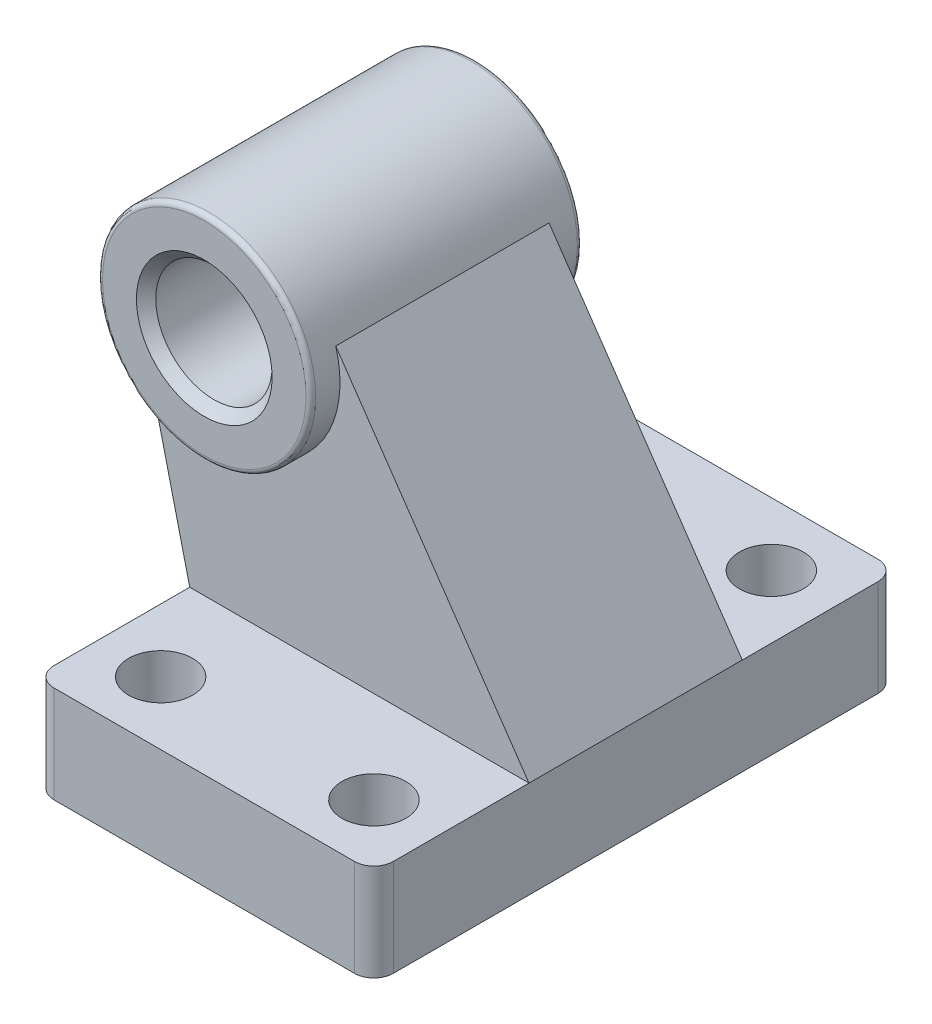
ISO-10303-21;
HEADER;
FILE_DESCRIPTION(('STEP AP214'),'2;1');
FILE_NAME('part.step','',(''),(''),'','','');
FILE_SCHEMA(('AUTOMOTIVE_DESIGN { 1 0 10303 214 1 1 1 1 }'));
ENDSEC;
DATA;
#1=APPLICATION_CONTEXT('core data for automotive mechanical design processes');
#2=APPLICATION_PROTOCOL_DEFINITION('international standard','automotive_design',2000,#1);
#3=PRODUCT_CONTEXT('',#1,'mechanical');
#4=PRODUCT('Part','Part','',(#3));
#5=PRODUCT_RELATED_PRODUCT_CATEGORY('part','',(#4));
#6=PRODUCT_DEFINITION_FORMATION('','',#4);
#7=PRODUCT_DEFINITION_CONTEXT('part definition',#1,'design');
#8=PRODUCT_DEFINITION('design','',#6,#7);
#9=PRODUCT_DEFINITION_SHAPE('','',#8);
#10=(LENGTH_UNIT() NAMED_UNIT(*) SI_UNIT(.MILLI.,.METRE.));
#11=(NAMED_UNIT(*) PLANE_ANGLE_UNIT() SI_UNIT($,.RADIAN.));
#12=(NAMED_UNIT(*) SI_UNIT($,.STERADIAN.) SOLID_ANGLE_UNIT());
#13=UNCERTAINTY_MEASURE_WITH_UNIT(LENGTH_MEASURE(1.E-05),#10,'distance_accuracy_value','');
#14=(GEOMETRIC_REPRESENTATION_CONTEXT(3) GLOBAL_UNCERTAINTY_ASSIGNED_CONTEXT((#13)) GLOBAL_UNIT_ASSIGNED_CONTEXT((#10,
#11,#12)) REPRESENTATION_CONTEXT('',''));
#15=CARTESIAN_POINT('',(0.,0.,0.));
#16=DIRECTION('',(0.,0.,1.));
#17=DIRECTION('',(1.,0.,0.));
#18=AXIS2_PLACEMENT_3D('',#15,#16,#17);
#19=CARTESIAN_POINT('',(-13.,26.,14.));
#20=DIRECTION('',(0.,0.,-1.));
#21=DIRECTION('',(-1.,0.,0.));
#22=AXIS2_PLACEMENT_3D('',#19,#20,#21);
#23=CYLINDRICAL_SURFACE('',#22,6.);
#24=CARTESIAN_POINT('',(-13.,26.,-13.0000000000337));
#25=DIRECTION('',(0.,0.,-1.));
#26=DIRECTION('',(-1.,0.,0.));
#27=AXIS2_PLACEMENT_3D('',#24,#25,#26);
#28=CIRCLE('',#27,6.00000000000546);
#29=CARTESIAN_POINT('',(-19.0000000000055,26.,-13.0000000000337));
#30=VERTEX_POINT('',#29);
#31=EDGE_CURVE('E369',#30,#30,#28,.T.);
#32=ORIENTED_EDGE('',*,*,#31,.T.);
#33=EDGE_LOOP('',(#32));
#34=FACE_BOUND('',#33,.T.);
#35=CARTESIAN_POINT('',(-13.,26.,12.9999999999768));
#36=DIRECTION('',(0.,0.,1.));
#37=DIRECTION('',(1.,0.,0.));
#38=AXIS2_PLACEMENT_3D('',#35,#36,#37);
#39=CIRCLE('',#38,5.999999999995);
#40=CARTESIAN_POINT('',(-7.000000000005,26.,12.9999999999768));
#41=VERTEX_POINT('',#40);
#42=EDGE_CURVE('E420',#41,#41,#39,.T.);
#43=ORIENTED_EDGE('',*,*,#42,.T.);
#44=EDGE_LOOP('',(#43));
#45=FACE_BOUND('',#44,.T.);
#46=ADVANCED_FACE('F15',(#34,#45),#23,.F.);
#47=CARTESIAN_POINT('',(-13.,26.,14.00000000001));
#48=DIRECTION('',(0.,0.,1.));
#49=DIRECTION('',(1.,0.,0.));
#50=AXIS2_PLACEMENT_3D('',#47,#48,#49);
#51=CONICAL_SURFACE('',#50,7.0000000000282,0.785398163397448);
#52=ORIENTED_EDGE('',*,*,#42,.F.);
#53=EDGE_LOOP('',(#52));
#54=FACE_BOUND('',#53,.T.);
#55=CARTESIAN_POINT('',(-13.,26.,14.00000000001));
#56=DIRECTION('',(0.,0.,1.));
#57=DIRECTION('',(1.,0.,0.));
#58=AXIS2_PLACEMENT_3D('',#55,#56,#57);
#59=CIRCLE('',#58,7.0000000000282);
#60=CARTESIAN_POINT('',(-5.99999999997181,26.,14.00000000001));
#61=VERTEX_POINT('',#60);
#62=EDGE_CURVE('E18',#61,#61,#59,.T.);
#63=ORIENTED_EDGE('',*,*,#62,.T.);
#64=EDGE_LOOP('',(#63));
#65=FACE_BOUND('',#64,.T.);
#66=ADVANCED_FACE('F252',(#54,#65),#51,.F.);
#67=CARTESIAN_POINT('',(-13.,26.,-13.9999999999532));
#68=DIRECTION('',(0.,0.,-1.));
#69=DIRECTION('',(-1.,0.,0.));
#70=AXIS2_PLACEMENT_3D('',#67,#68,#69);
#71=CONICAL_SURFACE('',#70,6.99999999992497,0.785398163369027);
#72=CARTESIAN_POINT('',(-13.,26.,-14.00000000001));
#73=DIRECTION('',(0.,0.,-1.));
#74=DIRECTION('',(-1.,0.,0.));
#75=AXIS2_PLACEMENT_3D('',#72,#73,#74);
#76=CIRCLE('',#75,6.99999999998181);
#77=CARTESIAN_POINT('',(-19.9999999999818,26.,-14.00000000001));
#78=VERTEX_POINT('',#77);
#79=EDGE_CURVE('E365',#78,#78,#76,.T.);
#80=ORIENTED_EDGE('',*,*,#79,.T.);
#81=EDGE_LOOP('',(#80));
#82=FACE_BOUND('',#81,.T.);
#83=ORIENTED_EDGE('',*,*,#31,.F.);
#84=EDGE_LOOP('',(#83));
#85=FACE_BOUND('',#84,.T.);
#86=ADVANCED_FACE('F249',(#82,#85),#71,.F.);
#87=CARTESIAN_POINT('',(-2.5,26.,14.));
#88=DIRECTION('',(0.,0.,-1.));
#89=DIRECTION('',(-1.,0.,0.));
#90=AXIS2_PLACEMENT_3D('',#87,#88,#89);
#91=PLANE('',#90);
#92=CARTESIAN_POINT('',(-13.,26.,14.));
#93=DIRECTION('',(0.,0.,-1.));
#94=DIRECTION('',(1.,0.,0.));
#95=AXIS2_PLACEMENT_3D('',#92,#93,#94);
#96=CIRCLE('',#95,10.5);
#97=CARTESIAN_POINT('',(-2.5,26.,14.));
#98=VERTEX_POINT('',#97);
#99=EDGE_CURVE('E233',#98,#98,#96,.T.);
#100=ORIENTED_EDGE('',*,*,#99,.F.);
#101=EDGE_LOOP('',(#100));
#102=FACE_BOUND('',#101,.T.);
#103=ORIENTED_EDGE('',*,*,#62,.F.);
#104=EDGE_LOOP('',(#103));
#105=FACE_BOUND('',#104,.T.);
#106=ADVANCED_FACE('F239',(#102,#105),#91,.F.);
#107=CARTESIAN_POINT('',(-13.,26.,-14.));
#108=DIRECTION('',(0.,0.,1.));
#109=DIRECTION('',(1.,0.,0.));
#110=AXIS2_PLACEMENT_3D('',#107,#108,#109);
#111=PLANE('',#110);
#112=ORIENTED_EDGE('',*,*,#79,.F.);
#113=EDGE_LOOP('',(#112));
#114=FACE_BOUND('',#113,.T.);
#115=CARTESIAN_POINT('',(-13.,26.,-14.));
#116=DIRECTION('',(0.,0.,1.));
#117=DIRECTION('',(1.,0.,0.));
#118=AXIS2_PLACEMENT_3D('',#115,#116,#117);
#119=CIRCLE('',#118,10.5);
#120=CARTESIAN_POINT('',(-2.5,26.,-14.));
#121=VERTEX_POINT('',#120);
#122=EDGE_CURVE('E196',#121,#121,#119,.T.);
#123=ORIENTED_EDGE('',*,*,#122,.F.);
#124=EDGE_LOOP('',(#123));
#125=FACE_BOUND('',#124,.T.);
#126=ADVANCED_FACE('F248',(#114,#125),#111,.F.);
#127=CARTESIAN_POINT('',(-13.,26.,13.5));
#128=DIRECTION('',(0.,0.,1.));
#129=DIRECTION('',(1.,0.,0.));
#130=AXIS2_PLACEMENT_3D('',#127,#128,#129);
#131=TOROIDAL_SURFACE('',#130,10.5,0.500000000000001);
#132=ORIENTED_EDGE('',*,*,#99,.T.);
#133=EDGE_LOOP('',(#132));
#134=FACE_BOUND('',#133,.T.);
#135=CARTESIAN_POINT('',(-13.,26.,13.5));
#136=DIRECTION('',(0.,0.,-1.));
#137=DIRECTION('',(-1.,0.,0.));
#138=AXIS2_PLACEMENT_3D('',#135,#136,#137);
#139=CIRCLE('',#138,11.);
#140=CARTESIAN_POINT('',(-24.,26.,13.5));
#141=VERTEX_POINT('',#140);
#142=EDGE_CURVE('E191',#141,#141,#139,.T.);
#143=ORIENTED_EDGE('',*,*,#142,.F.);
#144=EDGE_LOOP('',(#143));
#145=FACE_BOUND('',#144,.T.);
#146=ADVANCED_FACE('F212',(#134,#145),#131,.T.);
#147=CARTESIAN_POINT('',(-13.,26.,-13.5));
#148=DIRECTION('',(0.,0.,1.));
#149=DIRECTION('',(1.,0.,0.));
#150=AXIS2_PLACEMENT_3D('',#147,#148,#149);
#151=TOROIDAL_SURFACE('',#150,10.5,0.499999999999999);
#152=CARTESIAN_POINT('',(-13.,26.,-13.5));
#153=DIRECTION('',(0.,0.,-1.));
#154=DIRECTION('',(-1.,0.,0.));
#155=AXIS2_PLACEMENT_3D('',#152,#153,#154);
#156=CIRCLE('',#155,11.);
#157=CARTESIAN_POINT('',(-24.,26.,-13.5));
#158=VERTEX_POINT('',#157);
#159=EDGE_CURVE('E188',#158,#158,#156,.F.);
#160=ORIENTED_EDGE('',*,*,#159,.F.);
#161=EDGE_LOOP('',(#160));
#162=FACE_BOUND('',#161,.T.);
#163=ORIENTED_EDGE('',*,*,#122,.T.);
#164=EDGE_LOOP('',(#163));
#165=FACE_BOUND('',#164,.T.);
#166=ADVANCED_FACE('F206',(#162,#165),#151,.T.);
#167=CARTESIAN_POINT('',(-13.,26.,14.));
#168=DIRECTION('',(0.,0.,-1.));
#169=DIRECTION('',(-1.,0.,0.));
#170=AXIS2_PLACEMENT_3D('',#167,#168,#169);
#171=CYLINDRICAL_SURFACE('',#170,11.);
#172=ORIENTED_EDGE('',*,*,#159,.T.);
#173=EDGE_LOOP('',(#172));
#174=FACE_BOUND('',#173,.T.);
#175=CARTESIAN_POINT('',(-13.,26.,11.));
#176=DIRECTION('',(0.,0.,-1.));
#177=DIRECTION('',(-1.,0.,0.));
#178=AXIS2_PLACEMENT_3D('',#175,#176,#177);
#179=CIRCLE('',#178,11.);
#180=CARTESIAN_POINT('',(-2.43917478837608,29.0771692916589,11.));
#181=VERTEX_POINT('',#180);
#182=CARTESIAN_POINT('',(-22.3583049065752,20.2188124683962,11.));
#183=VERTEX_POINT('',#182);
#184=EDGE_CURVE('E96',#181,#183,#179,.T.);
#185=ORIENTED_EDGE('',*,*,#184,.F.);
#186=DIRECTION('',(0.,0.,1.));
#187=VECTOR('',#186,1.);
#188=CARTESIAN_POINT('',(-2.43917478837607,29.0771692916589,11.));
#189=LINE('',#188,#187);
#190=CARTESIAN_POINT('',(-2.43917478837608,29.0771692916589,-11.));
#191=VERTEX_POINT('',#190);
#192=EDGE_CURVE('E124',#181,#191,#189,.F.);
#193=ORIENTED_EDGE('',*,*,#192,.T.);
#194=CARTESIAN_POINT('',(-13.,26.,-11.));
#195=DIRECTION('',(0.,0.,-1.));
#196=DIRECTION('',(-1.,0.,0.));
#197=AXIS2_PLACEMENT_3D('',#194,#195,#196);
#198=CIRCLE('',#197,11.);
#199=CARTESIAN_POINT('',(-22.3583049065752,20.2188124683962,-11.));
#200=VERTEX_POINT('',#199);
#201=EDGE_CURVE('E185',#191,#200,#198,.T.);
#202=ORIENTED_EDGE('',*,*,#201,.T.);
#203=DIRECTION('',(0.,0.,1.));
#204=VECTOR('',#203,1.);
#205=CARTESIAN_POINT('',(-22.3583049065751,20.2188124683961,11.));
#206=LINE('',#205,#204);
#207=EDGE_CURVE('E162',#200,#183,#206,.T.);
#208=ORIENTED_EDGE('',*,*,#207,.T.);
#209=EDGE_LOOP('',(#185,#193,#202,#208));
#210=FACE_BOUND('',#209,.T.);
#211=ORIENTED_EDGE('',*,*,#142,.T.);
#212=EDGE_LOOP('',(#211));
#213=FACE_BOUND('',#212,.T.);
#214=ADVANCED_FACE('F211',(#174,#210,#213),#171,.T.);
#215=CARTESIAN_POINT('',(-13.,26.,11.));
#216=DIRECTION('',(0.,0.,1.));
#217=DIRECTION('',(1.,0.,0.));
#218=AXIS2_PLACEMENT_3D('',#215,#216,#217);
#219=PLANE('',#218);
#220=DIRECTION('',(-0.23363621677505,0.972324080855268,0.));
#221=VECTOR('',#220,1.);
#222=CARTESIAN_POINT('',(-23.1607866449376,23.5585015347007,11.));
#223=LINE('',#222,#221);
#224=CARTESIAN_POINT('',(-17.5,0.,11.));
#225=VERTEX_POINT('',#224);
#226=EDGE_CURVE('E141',#183,#225,#223,.F.);
#227=ORIENTED_EDGE('',*,*,#226,.T.);
#228=DIRECTION('',(1.,0.,0.));
#229=VECTOR('',#228,1.);
#230=CARTESIAN_POINT('',(-15.5,0.,11.));
#231=LINE('',#230,#229);
#232=CARTESIAN_POINT('',(17.5,0.,11.));
#233=VERTEX_POINT('',#232);
#234=EDGE_CURVE('E103',#233,#225,#231,.F.);
#235=ORIENTED_EDGE('',*,*,#234,.F.);
#236=DIRECTION('',(0.565538858407028,-0.824721649789598,0.));
#237=VECTOR('',#236,1.);
#238=CARTESIAN_POINT('',(17.5,0.,11.));
#239=LINE('',#238,#237);
#240=EDGE_CURVE('E119',#233,#181,#239,.F.);
#241=ORIENTED_EDGE('',*,*,#240,.T.);
#242=ORIENTED_EDGE('',*,*,#184,.T.);
#243=EDGE_LOOP('',(#227,#235,#241,#242));
#244=FACE_BOUND('',#243,.T.);
#245=ADVANCED_FACE('F139',(#244),#219,.T.);
#246=CARTESIAN_POINT('',(-13.,26.,-11.));
#247=DIRECTION('',(0.,0.,1.));
#248=DIRECTION('',(1.,0.,0.));
#249=AXIS2_PLACEMENT_3D('',#246,#247,#248);
#250=PLANE('',#249);
#251=ORIENTED_EDGE('',*,*,#201,.F.);
#252=DIRECTION('',(0.565538858407028,-0.824721649789598,0.));
#253=VECTOR('',#252,1.);
#254=CARTESIAN_POINT('',(17.5,0.,-11.));
#255=LINE('',#254,#253);
#256=CARTESIAN_POINT('',(17.5,0.,-11.));
#257=VERTEX_POINT('',#256);
#258=EDGE_CURVE('E126',#191,#257,#255,.T.);
#259=ORIENTED_EDGE('',*,*,#258,.T.);
#260=DIRECTION('',(1.,0.,0.));
#261=VECTOR('',#260,1.);
#262=CARTESIAN_POINT('',(-15.5,0.,-11.));
#263=LINE('',#262,#261);
#264=CARTESIAN_POINT('',(-17.5,0.,-11.));
#265=VERTEX_POINT('',#264);
#266=EDGE_CURVE('E142',#265,#257,#263,.T.);
#267=ORIENTED_EDGE('',*,*,#266,.F.);
#268=DIRECTION('',(-0.23363621677505,0.972324080855268,0.));
#269=VECTOR('',#268,1.);
#270=CARTESIAN_POINT('',(-23.1607866449376,23.5585015347007,-11.));
#271=LINE('',#270,#269);
#272=EDGE_CURVE('E110',#265,#200,#271,.T.);
#273=ORIENTED_EDGE('',*,*,#272,.T.);
#274=EDGE_LOOP('',(#251,#259,#267,#273));
#275=FACE_BOUND('',#274,.T.);
#276=ADVANCED_FACE('F344',(#275),#250,.F.);
#277=CARTESIAN_POINT('',(11.,-10.,-20.5));
#278=DIRECTION('',(0.,1.,0.));
#279=DIRECTION('',(0.,0.,1.));
#280=AXIS2_PLACEMENT_3D('',#277,#278,#279);
#281=CYLINDRICAL_SURFACE('',#280,3.3);
#282=CARTESIAN_POINT('',(11.,0.,-20.5));
#283=DIRECTION('',(0.,1.,0.));
#284=DIRECTION('',(0.,0.,1.));
#285=AXIS2_PLACEMENT_3D('',#282,#283,#284);
#286=CIRCLE('',#285,3.3);
#287=CARTESIAN_POINT('',(11.,0.,-17.2));
#288=VERTEX_POINT('',#287);
#289=EDGE_CURVE('E375',#288,#288,#286,.F.);
#290=ORIENTED_EDGE('',*,*,#289,.F.);
#291=EDGE_LOOP('',(#290));
#292=FACE_BOUND('',#291,.T.);
#293=CARTESIAN_POINT('',(11.,-9.50000000000273,-20.5));
#294=DIRECTION('',(0.,-1.,0.));
#295=DIRECTION('',(0.,0.,-1.));
#296=AXIS2_PLACEMENT_3D('',#293,#294,#295);
#297=CIRCLE('',#296,3.30000000005111);
#298=CARTESIAN_POINT('',(11.,-9.50000000000273,-23.8000000000511));
#299=VERTEX_POINT('',#298);
#300=EDGE_CURVE('E384',#299,#299,#297,.T.);
#301=ORIENTED_EDGE('',*,*,#300,.T.);
#302=EDGE_LOOP('',(#301));
#303=FACE_BOUND('',#302,.T.);
#304=ADVANCED_FACE('F340',(#292,#303),#281,.F.);
#305=CARTESIAN_POINT('',(11.,-10.,20.5));
#306=DIRECTION('',(0.,1.,0.));
#307=DIRECTION('',(0.,0.,1.));
#308=AXIS2_PLACEMENT_3D('',#305,#306,#307);
#309=CYLINDRICAL_SURFACE('',#308,3.3);
#310=CARTESIAN_POINT('',(11.,0.,20.5));
#311=DIRECTION('',(0.,1.,0.));
#312=DIRECTION('',(0.,0.,1.));
#313=AXIS2_PLACEMENT_3D('',#310,#311,#312);
#314=CIRCLE('',#313,3.3);
#315=CARTESIAN_POINT('',(11.,0.,23.8));
#316=VERTEX_POINT('',#315);
#317=EDGE_CURVE('E143',#316,#316,#314,.F.);
#318=ORIENTED_EDGE('',*,*,#317,.F.);
#319=EDGE_LOOP('',(#318));
#320=FACE_BOUND('',#319,.T.);
#321=CARTESIAN_POINT('',(11.,-9.50000000000273,20.5));
#322=DIRECTION('',(0.,-1.,0.));
#323=DIRECTION('',(0.,0.,-1.));
#324=AXIS2_PLACEMENT_3D('',#321,#322,#323);
#325=CIRCLE('',#324,3.3000000000543);
#326=CARTESIAN_POINT('',(11.,-9.50000000000273,17.1999999999457));
#327=VERTEX_POINT('',#326);
#328=EDGE_CURVE('E174',#327,#327,#325,.T.);
#329=ORIENTED_EDGE('',*,*,#328,.T.);
#330=EDGE_LOOP('',(#329));
#331=FACE_BOUND('',#330,.T.);
#332=ADVANCED_FACE('F337',(#320,#331),#309,.F.);
#333=CARTESIAN_POINT('',(-23.1607866449376,23.5585015347007,11.));
#334=DIRECTION('',(0.972324080855268,0.23363621677505,0.));
#335=DIRECTION('',(-0.23363621677505,0.972324080855268,0.));
#336=AXIS2_PLACEMENT_3D('',#333,#334,#335);
#337=PLANE('',#336);
#338=ORIENTED_EDGE('',*,*,#272,.F.);
#339=DIRECTION('',(0.,0.,1.));
#340=VECTOR('',#339,1.);
#341=CARTESIAN_POINT('',(-17.5,0.,-25.));
#342=LINE('',#341,#340);
#343=EDGE_CURVE('E173',#225,#265,#342,.F.);
#344=ORIENTED_EDGE('',*,*,#343,.F.);
#345=ORIENTED_EDGE('',*,*,#226,.F.);
#346=ORIENTED_EDGE('',*,*,#207,.F.);
#347=EDGE_LOOP('',(#338,#344,#345,#346));
#348=FACE_BOUND('',#347,.T.);
#349=ADVANCED_FACE('F334',(#348),#337,.F.);
#350=CARTESIAN_POINT('',(17.5,0.,11.));
#351=DIRECTION('',(-0.824721649789598,-0.565538858407028,0.));
#352=DIRECTION('',(0.565538858407028,-0.824721649789598,0.));
#353=AXIS2_PLACEMENT_3D('',#350,#351,#352);
#354=PLANE('',#353);
#355=ORIENTED_EDGE('',*,*,#240,.F.);
#356=DIRECTION('',(0.,0.,-1.));
#357=VECTOR('',#356,1.);
#358=CARTESIAN_POINT('',(17.5,0.,25.));
#359=LINE('',#358,#357);
#360=EDGE_CURVE('E123',#257,#233,#359,.F.);
#361=ORIENTED_EDGE('',*,*,#360,.F.);
#362=ORIENTED_EDGE('',*,*,#258,.F.);
#363=ORIENTED_EDGE('',*,*,#192,.F.);
#364=EDGE_LOOP('',(#355,#361,#362,#363));
#365=FACE_BOUND('',#364,.T.);
#366=ADVANCED_FACE('F121',(#365),#354,.F.);
#367=CARTESIAN_POINT('',(-15.5,0.,-25.));
#368=DIRECTION('',(0.,1.,0.));
#369=DIRECTION('',(0.,0.,1.));
#370=AXIS2_PLACEMENT_3D('',#367,#368,#369);
#371=PLANE('',#370);
#372=CARTESIAN_POINT('',(-11.,0.,20.5));
#373=DIRECTION('',(0.,1.,0.));
#374=DIRECTION('',(0.,0.,1.));
#375=AXIS2_PLACEMENT_3D('',#372,#373,#374);
#376=CIRCLE('',#375,3.3);
#377=CARTESIAN_POINT('',(-11.,0.,23.8));
#378=VERTEX_POINT('',#377);
#379=EDGE_CURVE('E381',#378,#378,#376,.F.);
#380=ORIENTED_EDGE('',*,*,#379,.T.);
#381=EDGE_LOOP('',(#380));
#382=FACE_BOUND('',#381,.T.);
#383=CARTESIAN_POINT('',(15.5,0.,25.));
#384=DIRECTION('',(0.,-1.,0.));
#385=DIRECTION('',(0.,0.,-1.));
#386=AXIS2_PLACEMENT_3D('',#383,#384,#385);
#387=CIRCLE('',#386,2.);
#388=CARTESIAN_POINT('',(17.5,0.,25.));
#389=VERTEX_POINT('',#388);
#390=CARTESIAN_POINT('',(15.5,0.,27.));
#391=VERTEX_POINT('',#390);
#392=EDGE_CURVE('E148',#389,#391,#387,.T.);
#393=ORIENTED_EDGE('',*,*,#392,.F.);
#394=DIRECTION('',(0.,0.,-1.));
#395=VECTOR('',#394,1.);
#396=CARTESIAN_POINT('',(17.5,0.,25.));
#397=LINE('',#396,#395);
#398=EDGE_CURVE('E132',#233,#389,#397,.F.);
#399=ORIENTED_EDGE('',*,*,#398,.F.);
#400=ORIENTED_EDGE('',*,*,#234,.T.);
#401=DIRECTION('',(0.,0.,1.));
#402=VECTOR('',#401,1.);
#403=CARTESIAN_POINT('',(-17.5,0.,-25.));
#404=LINE('',#403,#402);
#405=CARTESIAN_POINT('',(-17.5,0.,25.));
#406=VERTEX_POINT('',#405);
#407=EDGE_CURVE('E171',#406,#225,#404,.F.);
#408=ORIENTED_EDGE('',*,*,#407,.F.);
#409=CARTESIAN_POINT('',(-15.5,0.,25.));
#410=DIRECTION('',(0.,-1.,0.));
#411=DIRECTION('',(0.,0.,-1.));
#412=AXIS2_PLACEMENT_3D('',#409,#410,#411);
#413=CIRCLE('',#412,2.);
#414=CARTESIAN_POINT('',(-15.5,0.,27.));
#415=VERTEX_POINT('',#414);
#416=EDGE_CURVE('E385',#415,#406,#413,.T.);
#417=ORIENTED_EDGE('',*,*,#416,.F.);
#418=DIRECTION('',(1.,0.,0.));
#419=VECTOR('',#418,1.);
#420=CARTESIAN_POINT('',(-15.5,0.,27.));
#421=LINE('',#420,#419);
#422=EDGE_CURVE('E167',#391,#415,#421,.F.);
#423=ORIENTED_EDGE('',*,*,#422,.F.);
#424=EDGE_LOOP('',(#393,#399,#400,#408,#417,#423));
#425=FACE_BOUND('',#424,.T.);
#426=ORIENTED_EDGE('',*,*,#317,.T.);
#427=EDGE_LOOP('',(#426));
#428=FACE_BOUND('',#427,.T.);
#429=ADVANCED_FACE('F145',(#382,#425,#428),#371,.T.);
#430=CARTESIAN_POINT('',(-15.5,0.,-25.));
#431=DIRECTION('',(0.,1.,0.));
#432=DIRECTION('',(0.,0.,1.));
#433=AXIS2_PLACEMENT_3D('',#430,#431,#432);
#434=PLANE('',#433);
#435=ORIENTED_EDGE('',*,*,#289,.T.);
#436=EDGE_LOOP('',(#435));
#437=FACE_BOUND('',#436,.T.);
#438=DIRECTION('',(-1.,0.,0.));
#439=VECTOR('',#438,1.);
#440=CARTESIAN_POINT('',(15.5,0.,-27.));
#441=LINE('',#440,#439);
#442=CARTESIAN_POINT('',(-15.5,0.,-27.));
#443=VERTEX_POINT('',#442);
#444=CARTESIAN_POINT('',(15.5,0.,-27.));
#445=VERTEX_POINT('',#444);
#446=EDGE_CURVE('E453',#443,#445,#441,.F.);
#447=ORIENTED_EDGE('',*,*,#446,.F.);
#448=CARTESIAN_POINT('',(-15.5,0.,-25.));
#449=DIRECTION('',(0.,-1.,0.));
#450=DIRECTION('',(0.,0.,-1.));
#451=AXIS2_PLACEMENT_3D('',#448,#449,#450);
#452=CIRCLE('',#451,2.);
#453=CARTESIAN_POINT('',(-17.5,0.,-25.));
#454=VERTEX_POINT('',#453);
#455=EDGE_CURVE('E391',#454,#443,#452,.T.);
#456=ORIENTED_EDGE('',*,*,#455,.F.);
#457=DIRECTION('',(0.,0.,1.));
#458=VECTOR('',#457,1.);
#459=CARTESIAN_POINT('',(-17.5,0.,-25.));
#460=LINE('',#459,#458);
#461=EDGE_CURVE('E178',#265,#454,#460,.F.);
#462=ORIENTED_EDGE('',*,*,#461,.F.);
#463=ORIENTED_EDGE('',*,*,#266,.T.);
#464=DIRECTION('',(0.,0.,-1.));
#465=VECTOR('',#464,1.);
#466=CARTESIAN_POINT('',(17.5,0.,25.));
#467=LINE('',#466,#465);
#468=CARTESIAN_POINT('',(17.5,0.,-25.));
#469=VERTEX_POINT('',#468);
#470=EDGE_CURVE('E135',#469,#257,#467,.F.);
#471=ORIENTED_EDGE('',*,*,#470,.F.);
#472=CARTESIAN_POINT('',(15.5,0.,-25.));
#473=DIRECTION('',(0.,-1.,0.));
#474=DIRECTION('',(0.,0.,-1.));
#475=AXIS2_PLACEMENT_3D('',#472,#473,#474);
#476=CIRCLE('',#475,2.);
#477=EDGE_CURVE('E388',#445,#469,#476,.T.);
#478=ORIENTED_EDGE('',*,*,#477,.F.);
#479=EDGE_LOOP('',(#447,#456,#462,#463,#471,#478));
#480=FACE_BOUND('',#479,.T.);
#481=CARTESIAN_POINT('',(-11.,0.,-20.5));
#482=DIRECTION('',(0.,1.,0.));
#483=DIRECTION('',(0.,0.,1.));
#484=AXIS2_PLACEMENT_3D('',#481,#482,#483);
#485=CIRCLE('',#484,3.3);
#486=CARTESIAN_POINT('',(-11.,0.,-17.2));
#487=VERTEX_POINT('',#486);
#488=EDGE_CURVE('E378',#487,#487,#485,.F.);
#489=ORIENTED_EDGE('',*,*,#488,.T.);
#490=EDGE_LOOP('',(#489));
#491=FACE_BOUND('',#490,.T.);
#492=ADVANCED_FACE('F324',(#437,#480,#491),#434,.T.);
#493=CARTESIAN_POINT('',(-11.,-10.,-20.5));
#494=DIRECTION('',(0.,1.,0.));
#495=DIRECTION('',(0.,0.,1.));
#496=AXIS2_PLACEMENT_3D('',#493,#494,#495);
#497=CYLINDRICAL_SURFACE('',#496,3.3);
#498=ORIENTED_EDGE('',*,*,#488,.F.);
#499=EDGE_LOOP('',(#498));
#500=FACE_BOUND('',#499,.T.);
#501=CARTESIAN_POINT('',(-11.,-9.50000000000273,-20.5));
#502=DIRECTION('',(0.,-1.,0.));
#503=DIRECTION('',(0.,0.,-1.));
#504=AXIS2_PLACEMENT_3D('',#501,#502,#503);
#505=CIRCLE('',#504,3.30000000005111);
#506=CARTESIAN_POINT('',(-11.,-9.50000000000273,-23.8000000000511));
#507=VERTEX_POINT('',#506);
#508=EDGE_CURVE('E501',#507,#507,#505,.T.);
#509=ORIENTED_EDGE('',*,*,#508,.T.);
#510=EDGE_LOOP('',(#509));
#511=FACE_BOUND('',#510,.T.);
#512=ADVANCED_FACE('F320',(#500,#511),#497,.F.);
#513=CARTESIAN_POINT('',(-11.,-10.,20.5));
#514=DIRECTION('',(0.,1.,0.));
#515=DIRECTION('',(0.,0.,1.));
#516=AXIS2_PLACEMENT_3D('',#513,#514,#515);
#517=CYLINDRICAL_SURFACE('',#516,3.3);
#518=ORIENTED_EDGE('',*,*,#379,.F.);
#519=EDGE_LOOP('',(#518));
#520=FACE_BOUND('',#519,.T.);
#521=CARTESIAN_POINT('',(-11.,-9.50000000000273,20.5));
#522=DIRECTION('',(0.,-1.,0.));
#523=DIRECTION('',(0.,0.,-1.));
#524=AXIS2_PLACEMENT_3D('',#521,#522,#523);
#525=CIRCLE('',#524,3.3000000000543);
#526=CARTESIAN_POINT('',(-11.,-9.50000000000273,17.1999999999457));
#527=VERTEX_POINT('',#526);
#528=EDGE_CURVE('E398',#527,#527,#525,.T.);
#529=ORIENTED_EDGE('',*,*,#528,.T.);
#530=EDGE_LOOP('',(#529));
#531=FACE_BOUND('',#530,.T.);
#532=ADVANCED_FACE('F316',(#520,#531),#517,.F.);
#533=CARTESIAN_POINT('',(11.,-9.99999999993406,-20.5));
#534=DIRECTION('',(0.,-1.,0.));
#535=DIRECTION('',(0.,0.,-1.));
#536=AXIS2_PLACEMENT_3D('',#533,#534,#535);
#537=CONICAL_SURFACE('',#536,3.7999999999256,0.785398163397448);
#538=ORIENTED_EDGE('',*,*,#300,.F.);
#539=EDGE_LOOP('',(#538));
#540=FACE_BOUND('',#539,.T.);
#541=CARTESIAN_POINT('',(11.,-10.0000000000477,-20.5));
#542=DIRECTION('',(0.,-1.,0.));
#543=DIRECTION('',(0.,0.,-1.));
#544=AXIS2_PLACEMENT_3D('',#541,#542,#543);
#545=CIRCLE('',#544,3.80000000003929);
#546=CARTESIAN_POINT('',(11.,-10.0000000000477,-24.3000000000393));
#547=VERTEX_POINT('',#546);
#548=EDGE_CURVE('E394',#547,#547,#545,.T.);
#549=ORIENTED_EDGE('',*,*,#548,.T.);
#550=EDGE_LOOP('',(#549));
#551=FACE_BOUND('',#550,.T.);
#552=ADVANCED_FACE('F312',(#540,#551),#537,.F.);
#553=CARTESIAN_POINT('',(11.,-9.99999999993406,20.5));
#554=DIRECTION('',(0.,-1.,0.));
#555=DIRECTION('',(0.,0.,-1.));
#556=AXIS2_PLACEMENT_3D('',#553,#554,#555);
#557=CONICAL_SURFACE('',#556,3.79999999998563,0.785398163454292);
#558=ORIENTED_EDGE('',*,*,#328,.F.);
#559=EDGE_LOOP('',(#558));
#560=FACE_BOUND('',#559,.T.);
#561=CARTESIAN_POINT('',(11.,-9.99999999999091,20.5));
#562=DIRECTION('',(0.,-1.,0.));
#563=DIRECTION('',(0.,0.,-1.));
#564=AXIS2_PLACEMENT_3D('',#561,#562,#563);
#565=CIRCLE('',#564,3.80000000004247);
#566=CARTESIAN_POINT('',(11.,-9.99999999999091,16.6999999999575));
#567=VERTEX_POINT('',#566);
#568=EDGE_CURVE('E397',#567,#567,#565,.T.);
#569=ORIENTED_EDGE('',*,*,#568,.T.);
#570=EDGE_LOOP('',(#569));
#571=FACE_BOUND('',#570,.T.);
#572=ADVANCED_FACE('F308',(#560,#571),#557,.F.);
#573=CARTESIAN_POINT('',(-17.5,-10.,-25.));
#574=DIRECTION('',(-1.,0.,0.));
#575=DIRECTION('',(0.,0.,1.));
#576=AXIS2_PLACEMENT_3D('',#573,#574,#575);
#577=PLANE('',#576);
#578=DIRECTION('',(0.,0.,1.));
#579=VECTOR('',#578,1.);
#580=CARTESIAN_POINT('',(-17.5,-10.,-25.));
#581=LINE('',#580,#579);
#582=CARTESIAN_POINT('',(-17.5,-10.,-25.));
#583=VERTEX_POINT('',#582);
#584=CARTESIAN_POINT('',(-17.5,-10.,25.));
#585=VERTEX_POINT('',#584);
#586=EDGE_CURVE('E401',#583,#585,#581,.T.);
#587=ORIENTED_EDGE('',*,*,#586,.T.);
#588=DIRECTION('',(0.,-1.,0.));
#589=VECTOR('',#588,1.);
#590=CARTESIAN_POINT('',(-17.5,-10.,25.));
#591=LINE('',#590,#589);
#592=EDGE_CURVE('E170',#406,#585,#591,.T.);
#593=ORIENTED_EDGE('',*,*,#592,.F.);
#594=ORIENTED_EDGE('',*,*,#407,.T.);
#595=ORIENTED_EDGE('',*,*,#343,.T.);
#596=ORIENTED_EDGE('',*,*,#461,.T.);
#597=DIRECTION('',(0.,-1.,0.));
#598=VECTOR('',#597,1.);
#599=CARTESIAN_POINT('',(-17.5,-10.,-25.));
#600=LINE('',#599,#598);
#601=EDGE_CURVE('E506',#583,#454,#600,.F.);
#602=ORIENTED_EDGE('',*,*,#601,.F.);
#603=EDGE_LOOP('',(#587,#593,#594,#595,#596,#602));
#604=FACE_BOUND('',#603,.T.);
#605=ADVANCED_FACE('F304',(#604),#577,.T.);
#606=CARTESIAN_POINT('',(-15.5,-10.,25.));
#607=DIRECTION('',(0.,-1.,0.));
#608=DIRECTION('',(0.,0.,-1.));
#609=AXIS2_PLACEMENT_3D('',#606,#607,#608);
#610=CYLINDRICAL_SURFACE('',#609,2.);
#611=CARTESIAN_POINT('',(-15.5,-10.,25.));
#612=DIRECTION('',(0.,-1.,0.));
#613=DIRECTION('',(0.,0.,-1.));
#614=AXIS2_PLACEMENT_3D('',#611,#612,#613);
#615=CIRCLE('',#614,2.);
#616=CARTESIAN_POINT('',(-15.5,-10.,27.));
#617=VERTEX_POINT('',#616);
#618=EDGE_CURVE('E402',#585,#617,#615,.F.);
#619=ORIENTED_EDGE('',*,*,#618,.T.);
#620=DIRECTION('',(0.,1.,0.));
#621=VECTOR('',#620,1.);
#622=CARTESIAN_POINT('',(-15.5,-10.,27.));
#623=LINE('',#622,#621);
#624=EDGE_CURVE('E169',#415,#617,#623,.F.);
#625=ORIENTED_EDGE('',*,*,#624,.F.);
#626=ORIENTED_EDGE('',*,*,#416,.T.);
#627=ORIENTED_EDGE('',*,*,#592,.T.);
#628=EDGE_LOOP('',(#619,#625,#626,#627));
#629=FACE_BOUND('',#628,.T.);
#630=ADVANCED_FACE('F300',(#629),#610,.T.);
#631=CARTESIAN_POINT('',(-15.5,-10.,27.));
#632=DIRECTION('',(0.,0.,1.));
#633=DIRECTION('',(1.,0.,0.));
#634=AXIS2_PLACEMENT_3D('',#631,#632,#633);
#635=PLANE('',#634);
#636=DIRECTION('',(1.,0.,0.));
#637=VECTOR('',#636,1.);
#638=CARTESIAN_POINT('',(-15.5,-10.,27.));
#639=LINE('',#638,#637);
#640=CARTESIAN_POINT('',(15.5,-10.,27.));
#641=VERTEX_POINT('',#640);
#642=EDGE_CURVE('E405',#617,#641,#639,.T.);
#643=ORIENTED_EDGE('',*,*,#642,.T.);
#644=DIRECTION('',(0.,-1.,0.));
#645=VECTOR('',#644,1.);
#646=CARTESIAN_POINT('',(15.5,-10.,27.));
#647=LINE('',#646,#645);
#648=EDGE_CURVE('E136',#391,#641,#647,.T.);
#649=ORIENTED_EDGE('',*,*,#648,.F.);
#650=ORIENTED_EDGE('',*,*,#422,.T.);
#651=ORIENTED_EDGE('',*,*,#624,.T.);
#652=EDGE_LOOP('',(#643,#649,#650,#651));
#653=FACE_BOUND('',#652,.T.);
#654=ADVANCED_FACE('F296',(#653),#635,.T.);
#655=CARTESIAN_POINT('',(15.5,-10.,25.));
#656=DIRECTION('',(0.,-1.,0.));
#657=DIRECTION('',(0.,0.,-1.));
#658=AXIS2_PLACEMENT_3D('',#655,#656,#657);
#659=CYLINDRICAL_SURFACE('',#658,2.);
#660=CARTESIAN_POINT('',(15.5,-10.,25.));
#661=DIRECTION('',(0.,-1.,0.));
#662=DIRECTION('',(0.,0.,-1.));
#663=AXIS2_PLACEMENT_3D('',#660,#661,#662);
#664=CIRCLE('',#663,2.);
#665=CARTESIAN_POINT('',(17.5,-10.,25.));
#666=VERTEX_POINT('',#665);
#667=EDGE_CURVE('E406',#641,#666,#664,.F.);
#668=ORIENTED_EDGE('',*,*,#667,.T.);
#669=DIRECTION('',(0.,1.,0.));
#670=VECTOR('',#669,1.);
#671=CARTESIAN_POINT('',(17.5,-10.,25.));
#672=LINE('',#671,#670);
#673=EDGE_CURVE('E150',#389,#666,#672,.F.);
#674=ORIENTED_EDGE('',*,*,#673,.F.);
#675=ORIENTED_EDGE('',*,*,#392,.T.);
#676=ORIENTED_EDGE('',*,*,#648,.T.);
#677=EDGE_LOOP('',(#668,#674,#675,#676));
#678=FACE_BOUND('',#677,.T.);
#679=ADVANCED_FACE('F293',(#678),#659,.T.);
#680=CARTESIAN_POINT('',(17.5,-10.,25.));
#681=DIRECTION('',(1.,0.,0.));
#682=DIRECTION('',(0.,0.,-1.));
#683=AXIS2_PLACEMENT_3D('',#680,#681,#682);
#684=PLANE('',#683);
#685=DIRECTION('',(0.,-1.,0.));
#686=VECTOR('',#685,1.);
#687=CARTESIAN_POINT('',(17.5,-10.,-25.));
#688=LINE('',#687,#686);
#689=CARTESIAN_POINT('',(17.5,-10.,-25.));
#690=VERTEX_POINT('',#689);
#691=EDGE_CURVE('E390',#469,#690,#688,.T.);
#692=ORIENTED_EDGE('',*,*,#691,.F.);
#693=ORIENTED_EDGE('',*,*,#470,.T.);
#694=ORIENTED_EDGE('',*,*,#360,.T.);
#695=ORIENTED_EDGE('',*,*,#398,.T.);
#696=ORIENTED_EDGE('',*,*,#673,.T.);
#697=DIRECTION('',(0.,0.,1.));
#698=VECTOR('',#697,1.);
#699=CARTESIAN_POINT('',(17.5,-10.,-25.));
#700=LINE('',#699,#698);
#701=EDGE_CURVE('E409',#666,#690,#700,.F.);
#702=ORIENTED_EDGE('',*,*,#701,.T.);
#703=EDGE_LOOP('',(#692,#693,#694,#695,#696,#702));
#704=FACE_BOUND('',#703,.T.);
#705=ADVANCED_FACE('F131',(#704),#684,.T.);
#706=CARTESIAN_POINT('',(15.5,-10.,-25.));
#707=DIRECTION('',(0.,-1.,0.));
#708=DIRECTION('',(0.,0.,-1.));
#709=AXIS2_PLACEMENT_3D('',#706,#707,#708);
#710=CYLINDRICAL_SURFACE('',#709,2.);
#711=CARTESIAN_POINT('',(15.5,-10.,-25.));
#712=DIRECTION('',(0.,-1.,0.));
#713=DIRECTION('',(0.,0.,-1.));
#714=AXIS2_PLACEMENT_3D('',#711,#712,#713);
#715=CIRCLE('',#714,2.);
#716=CARTESIAN_POINT('',(15.5,-10.,-27.));
#717=VERTEX_POINT('',#716);
#718=EDGE_CURVE('E410',#690,#717,#715,.F.);
#719=ORIENTED_EDGE('',*,*,#718,.T.);
#720=DIRECTION('',(0.,1.,0.));
#721=VECTOR('',#720,1.);
#722=CARTESIAN_POINT('',(15.5,-10.,-27.));
#723=LINE('',#722,#721);
#724=EDGE_CURVE('E393',#445,#717,#723,.F.);
#725=ORIENTED_EDGE('',*,*,#724,.F.);
#726=ORIENTED_EDGE('',*,*,#477,.T.);
#727=ORIENTED_EDGE('',*,*,#691,.T.);
#728=EDGE_LOOP('',(#719,#725,#726,#727));
#729=FACE_BOUND('',#728,.T.);
#730=ADVANCED_FACE('F286',(#729),#710,.T.);
#731=CARTESIAN_POINT('',(15.5,-10.,-27.));
#732=DIRECTION('',(0.,0.,-1.));
#733=DIRECTION('',(-1.,0.,0.));
#734=AXIS2_PLACEMENT_3D('',#731,#732,#733);
#735=PLANE('',#734);
#736=DIRECTION('',(1.,0.,0.));
#737=VECTOR('',#736,1.);
#738=CARTESIAN_POINT('',(-15.5,-10.,-27.));
#739=LINE('',#738,#737);
#740=CARTESIAN_POINT('',(-15.5,-10.,-27.));
#741=VERTEX_POINT('',#740);
#742=EDGE_CURVE('E413',#717,#741,#739,.F.);
#743=ORIENTED_EDGE('',*,*,#742,.T.);
#744=DIRECTION('',(0.,-1.,0.));
#745=VECTOR('',#744,1.);
#746=CARTESIAN_POINT('',(-15.5,-10.,-27.));
#747=LINE('',#746,#745);
#748=EDGE_CURVE('E33',#443,#741,#747,.T.);
#749=ORIENTED_EDGE('',*,*,#748,.F.);
#750=ORIENTED_EDGE('',*,*,#446,.T.);
#751=ORIENTED_EDGE('',*,*,#724,.T.);
#752=EDGE_LOOP('',(#743,#749,#750,#751));
#753=FACE_BOUND('',#752,.T.);
#754=ADVANCED_FACE('F283',(#753),#735,.T.);
#755=CARTESIAN_POINT('',(-15.5,-10.,-25.));
#756=DIRECTION('',(0.,-1.,0.));
#757=DIRECTION('',(0.,0.,-1.));
#758=AXIS2_PLACEMENT_3D('',#755,#756,#757);
#759=CYLINDRICAL_SURFACE('',#758,2.);
#760=CARTESIAN_POINT('',(-15.5,-10.,-25.));
#761=DIRECTION('',(0.,-1.,0.));
#762=DIRECTION('',(0.,0.,-1.));
#763=AXIS2_PLACEMENT_3D('',#760,#761,#762);
#764=CIRCLE('',#763,2.);
#765=EDGE_CURVE('E414',#741,#583,#764,.F.);
#766=ORIENTED_EDGE('',*,*,#765,.T.);
#767=ORIENTED_EDGE('',*,*,#601,.T.);
#768=ORIENTED_EDGE('',*,*,#455,.T.);
#769=ORIENTED_EDGE('',*,*,#748,.T.);
#770=EDGE_LOOP('',(#766,#767,#768,#769));
#771=FACE_BOUND('',#770,.T.);
#772=ADVANCED_FACE('F279',(#771),#759,.T.);
#773=CARTESIAN_POINT('',(-11.,-9.99999999993406,-20.5));
#774=DIRECTION('',(0.,-1.,0.));
#775=DIRECTION('',(0.,0.,-1.));
#776=AXIS2_PLACEMENT_3D('',#773,#774,#775);
#777=CONICAL_SURFACE('',#776,3.7999999999256,0.785398163397448);
#778=ORIENTED_EDGE('',*,*,#508,.F.);
#779=EDGE_LOOP('',(#778));
#780=FACE_BOUND('',#779,.T.);
#781=CARTESIAN_POINT('',(-11.,-10.0000000000477,-20.5));
#782=DIRECTION('',(0.,-1.,0.));
#783=DIRECTION('',(0.,0.,-1.));
#784=AXIS2_PLACEMENT_3D('',#781,#782,#783);
#785=CIRCLE('',#784,3.80000000003929);
#786=CARTESIAN_POINT('',(-11.,-10.0000000000477,-24.3000000000393));
#787=VERTEX_POINT('',#786);
#788=EDGE_CURVE('E24',#787,#787,#785,.T.);
#789=ORIENTED_EDGE('',*,*,#788,.T.);
#790=EDGE_LOOP('',(#789));
#791=FACE_BOUND('',#790,.T.);
#792=ADVANCED_FACE('F271',(#780,#791),#777,.F.);
#793=CARTESIAN_POINT('',(-11.,-9.99999999993406,20.5));
#794=DIRECTION('',(0.,-1.,0.));
#795=DIRECTION('',(0.,0.,-1.));
#796=AXIS2_PLACEMENT_3D('',#793,#794,#795);
#797=CONICAL_SURFACE('',#796,3.79999999998563,0.785398163454292);
#798=ORIENTED_EDGE('',*,*,#528,.F.);
#799=EDGE_LOOP('',(#798));
#800=FACE_BOUND('',#799,.T.);
#801=CARTESIAN_POINT('',(-11.,-9.99999999999091,20.5));
#802=DIRECTION('',(0.,-1.,0.));
#803=DIRECTION('',(0.,0.,-1.));
#804=AXIS2_PLACEMENT_3D('',#801,#802,#803);
#805=CIRCLE('',#804,3.80000000004247);
#806=CARTESIAN_POINT('',(-11.,-9.99999999999091,16.6999999999575));
#807=VERTEX_POINT('',#806);
#808=EDGE_CURVE('E10',#807,#807,#805,.T.);
#809=ORIENTED_EDGE('',*,*,#808,.T.);
#810=EDGE_LOOP('',(#809));
#811=FACE_BOUND('',#810,.T.);
#812=ADVANCED_FACE('F265',(#800,#811),#797,.F.);
#813=CARTESIAN_POINT('',(-15.5,-10.,-25.));
#814=DIRECTION('',(0.,1.,0.));
#815=DIRECTION('',(0.,0.,1.));
#816=AXIS2_PLACEMENT_3D('',#813,#814,#815);
#817=PLANE('',#816);
#818=ORIENTED_EDGE('',*,*,#808,.F.);
#819=EDGE_LOOP('',(#818));
#820=FACE_BOUND('',#819,.T.);
#821=ORIENTED_EDGE('',*,*,#788,.F.);
#822=EDGE_LOOP('',(#821));
#823=FACE_BOUND('',#822,.T.);
#824=ORIENTED_EDGE('',*,*,#742,.F.);
#825=ORIENTED_EDGE('',*,*,#718,.F.);
#826=ORIENTED_EDGE('',*,*,#701,.F.);
#827=ORIENTED_EDGE('',*,*,#667,.F.);
#828=ORIENTED_EDGE('',*,*,#642,.F.);
#829=ORIENTED_EDGE('',*,*,#618,.F.);
#830=ORIENTED_EDGE('',*,*,#586,.F.);
#831=ORIENTED_EDGE('',*,*,#765,.F.);
#832=EDGE_LOOP('',(#824,#825,#826,#827,#828,#829,#830,#831));
#833=FACE_BOUND('',#832,.T.);
#834=ORIENTED_EDGE('',*,*,#568,.F.);
#835=EDGE_LOOP('',(#834));
#836=FACE_BOUND('',#835,.T.);
#837=ORIENTED_EDGE('',*,*,#548,.F.);
#838=EDGE_LOOP('',(#837));
#839=FACE_BOUND('',#838,.T.);
#840=ADVANCED_FACE('F263',(#820,#823,#833,#836,#839),#817,.F.);
#841=CLOSED_SHELL('',(#46,#66,#86,#106,#126,#146,#166,#214,#245,#276,#304,#332,#349,#366,#429,
#492,#512,#532,#552,#572,#605,#630,#654,#679,#705,#730,#754,#772,#792,#812,#840));
#842=MANIFOLD_SOLID_BREP('B1',#841);
#843=ADVANCED_BREP_SHAPE_REPRESENTATION('',(#18,#842),#14);
#844=SHAPE_DEFINITION_REPRESENTATION(#9,#843);
ENDSEC;
END-ISO-10303-21;
